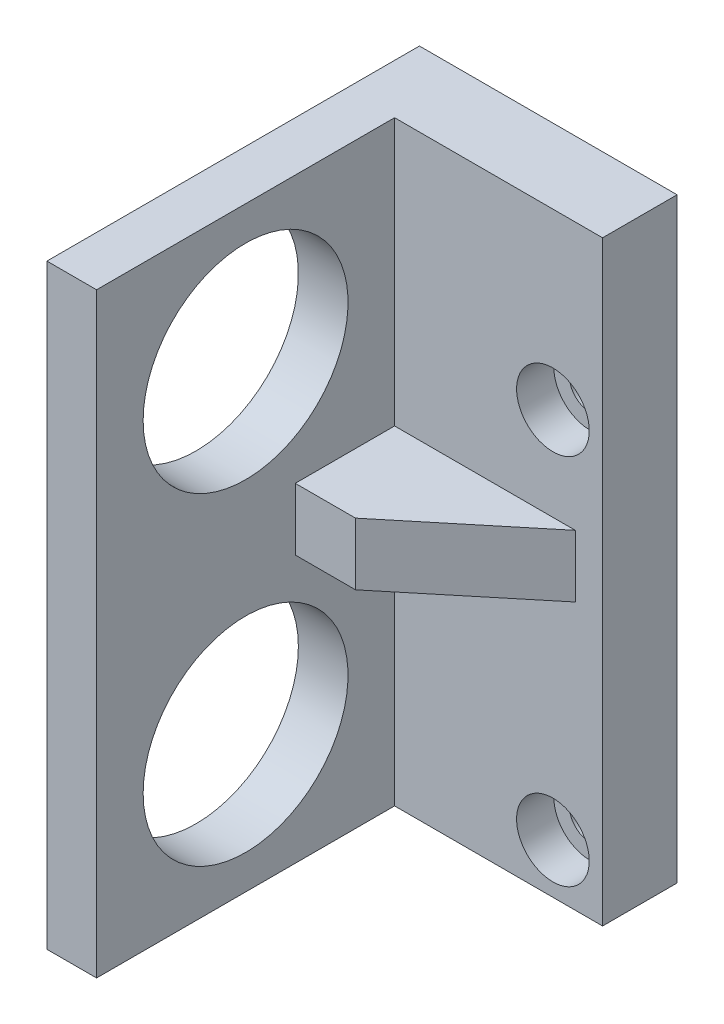
ISO-10303-21;
HEADER;
FILE_DESCRIPTION(('STEP AP214'),'2;1');
FILE_NAME('part.step','',(''),(''),'','','');
FILE_SCHEMA(('AUTOMOTIVE_DESIGN { 1 0 10303 214 1 1 1 1 }'));
ENDSEC;
DATA;
#1=APPLICATION_CONTEXT('core data for automotive mechanical design processes');
#2=APPLICATION_PROTOCOL_DEFINITION('international standard','automotive_design',2000,#1);
#3=PRODUCT_CONTEXT('',#1,'mechanical');
#4=PRODUCT('Part','Part','',(#3));
#5=PRODUCT_RELATED_PRODUCT_CATEGORY('part','',(#4));
#6=PRODUCT_DEFINITION_FORMATION('','',#4);
#7=PRODUCT_DEFINITION_CONTEXT('part definition',#1,'design');
#8=PRODUCT_DEFINITION('design','',#6,#7);
#9=PRODUCT_DEFINITION_SHAPE('','',#8);
#10=(LENGTH_UNIT() NAMED_UNIT(*) SI_UNIT(.MILLI.,.METRE.));
#11=(NAMED_UNIT(*) PLANE_ANGLE_UNIT() SI_UNIT($,.RADIAN.));
#12=(NAMED_UNIT(*) SI_UNIT($,.STERADIAN.) SOLID_ANGLE_UNIT());
#13=UNCERTAINTY_MEASURE_WITH_UNIT(LENGTH_MEASURE(1.E-05),#10,'distance_accuracy_value','');
#14=(GEOMETRIC_REPRESENTATION_CONTEXT(3) GLOBAL_UNCERTAINTY_ASSIGNED_CONTEXT((#13)) GLOBAL_UNIT_ASSIGNED_CONTEXT((#10,
#11,#12)) REPRESENTATION_CONTEXT('',''));
#15=CARTESIAN_POINT('',(0.,0.,0.));
#16=DIRECTION('',(0.,0.,1.));
#17=DIRECTION('',(1.,0.,0.));
#18=AXIS2_PLACEMENT_3D('',#15,#16,#17);
#19=CARTESIAN_POINT('',(18.5558838016959,26.5,6.));
#20=DIRECTION('',(-0.636111528755374,0.,-0.771597124790198));
#21=DIRECTION('',(-0.771597124790199,0.,0.636111528755374));
#22=AXIS2_PLACEMENT_3D('',#19,#20,#21);
#23=PLANE('',#22);
#24=DIRECTION('',(0.,1.,0.));
#25=VECTOR('',#24,1.);
#26=CARTESIAN_POINT('',(8.85196126723198,26.5,14.));
#27=LINE('',#26,#25);
#28=CARTESIAN_POINT('',(8.85196126723198,21.5,14.));
#29=VERTEX_POINT('',#28);
#30=CARTESIAN_POINT('',(8.85196126723198,26.5,14.));
#31=VERTEX_POINT('',#30);
#32=EDGE_CURVE('E218',#29,#31,#27,.T.);
#33=ORIENTED_EDGE('',*,*,#32,.F.);
#34=DIRECTION('',(0.771597124790198,0.,-0.636111528755374));
#35=VECTOR('',#34,1.);
#36=CARTESIAN_POINT('',(18.5558838016959,21.5,6.));
#37=LINE('',#36,#35);
#38=CARTESIAN_POINT('',(18.5558838016959,21.5,6.));
#39=VERTEX_POINT('',#38);
#40=EDGE_CURVE('E125',#29,#39,#37,.T.);
#41=ORIENTED_EDGE('',*,*,#40,.T.);
#42=DIRECTION('',(0.,-1.,0.));
#43=VECTOR('',#42,1.);
#44=CARTESIAN_POINT('',(18.5558838016959,26.5,6.));
#45=LINE('',#44,#43);
#46=CARTESIAN_POINT('',(18.5558838016959,26.5,6.));
#47=VERTEX_POINT('',#46);
#48=EDGE_CURVE('E136',#47,#39,#45,.T.);
#49=ORIENTED_EDGE('',*,*,#48,.F.);
#50=DIRECTION('',(0.771597124790198,0.,-0.636111528755374));
#51=VECTOR('',#50,1.);
#52=CARTESIAN_POINT('',(18.5558838016959,26.5,6.));
#53=LINE('',#52,#51);
#54=EDGE_CURVE('E128',#31,#47,#53,.T.);
#55=ORIENTED_EDGE('',*,*,#54,.F.);
#56=EDGE_LOOP('',(#33,#41,#49,#55));
#57=FACE_BOUND('',#56,.T.);
#58=ADVANCED_FACE('F33',(#57),#23,.F.);
#59=CARTESIAN_POINT('',(0.,26.5,0.));
#60=DIRECTION('',(0.,-1.,0.));
#61=DIRECTION('',(0.,0.,-1.));
#62=AXIS2_PLACEMENT_3D('',#59,#60,#61);
#63=PLANE('',#62);
#64=DIRECTION('',(-1.,0.,0.));
#65=VECTOR('',#64,1.);
#66=CARTESIAN_POINT('',(38.,26.5,14.));
#67=LINE('',#66,#65);
#68=CARTESIAN_POINT('',(4.,26.5,14.));
#69=VERTEX_POINT('',#68);
#70=EDGE_CURVE('E116',#31,#69,#67,.T.);
#71=ORIENTED_EDGE('',*,*,#70,.F.);
#72=ORIENTED_EDGE('',*,*,#54,.T.);
#73=DIRECTION('',(-1.,0.,0.));
#74=VECTOR('',#73,1.);
#75=CARTESIAN_POINT('',(4.,26.5,6.));
#76=LINE('',#75,#74);
#77=CARTESIAN_POINT('',(4.,26.5,6.));
#78=VERTEX_POINT('',#77);
#79=EDGE_CURVE('E131',#47,#78,#76,.T.);
#80=ORIENTED_EDGE('',*,*,#79,.T.);
#81=DIRECTION('',(0.,0.,1.));
#82=VECTOR('',#81,1.);
#83=CARTESIAN_POINT('',(4.,26.5,18.));
#84=LINE('',#83,#82);
#85=EDGE_CURVE('E140',#78,#69,#84,.T.);
#86=ORIENTED_EDGE('',*,*,#85,.T.);
#87=EDGE_LOOP('',(#71,#72,#80,#86));
#88=FACE_BOUND('',#87,.T.);
#89=ADVANCED_FACE('F229',(#88),#63,.F.);
#90=CARTESIAN_POINT('',(0.,21.5,0.));
#91=DIRECTION('',(0.,-1.,0.));
#92=DIRECTION('',(0.,0.,-1.));
#93=AXIS2_PLACEMENT_3D('',#90,#91,#92);
#94=PLANE('',#93);
#95=ORIENTED_EDGE('',*,*,#40,.F.);
#96=DIRECTION('',(-1.,0.,0.));
#97=VECTOR('',#96,1.);
#98=CARTESIAN_POINT('',(0.,21.5,14.));
#99=LINE('',#98,#97);
#100=CARTESIAN_POINT('',(4.,21.5,14.));
#101=VERTEX_POINT('',#100);
#102=EDGE_CURVE('E11',#29,#101,#99,.T.);
#103=ORIENTED_EDGE('',*,*,#102,.T.);
#104=DIRECTION('',(0.,0.,1.));
#105=VECTOR('',#104,1.);
#106=CARTESIAN_POINT('',(4.,21.5,18.));
#107=LINE('',#106,#105);
#108=CARTESIAN_POINT('',(4.,21.5,6.));
#109=VERTEX_POINT('',#108);
#110=EDGE_CURVE('E124',#109,#101,#107,.T.);
#111=ORIENTED_EDGE('',*,*,#110,.F.);
#112=DIRECTION('',(-1.,0.,0.));
#113=VECTOR('',#112,1.);
#114=CARTESIAN_POINT('',(4.,21.5,6.));
#115=LINE('',#114,#113);
#116=EDGE_CURVE('E129',#39,#109,#115,.T.);
#117=ORIENTED_EDGE('',*,*,#116,.F.);
#118=EDGE_LOOP('',(#95,#103,#111,#117));
#119=FACE_BOUND('',#118,.T.);
#120=ADVANCED_FACE('F122',(#119),#94,.T.);
#121=CARTESIAN_POINT('',(16.75,34.,6.));
#122=DIRECTION('',(0.,0.,-1.));
#123=DIRECTION('',(-1.,0.,0.));
#124=AXIS2_PLACEMENT_3D('',#121,#122,#123);
#125=CYLINDRICAL_SURFACE('',#124,1.67500000000001);
#126=CARTESIAN_POINT('',(16.75,34.,0.));
#127=DIRECTION('',(0.,0.,1.));
#128=DIRECTION('',(1.,0.,0.));
#129=AXIS2_PLACEMENT_3D('',#126,#127,#128);
#130=CIRCLE('',#129,1.67500000000001);
#131=CARTESIAN_POINT('',(18.425,34.,0.));
#132=VERTEX_POINT('',#131);
#133=EDGE_CURVE('E169',#132,#132,#130,.T.);
#134=ORIENTED_EDGE('',*,*,#133,.F.);
#135=EDGE_LOOP('',(#134));
#136=FACE_BOUND('',#135,.T.);
#137=CARTESIAN_POINT('',(16.75,34.,3.));
#138=DIRECTION('',(0.,0.,1.));
#139=DIRECTION('',(1.,0.,0.));
#140=AXIS2_PLACEMENT_3D('',#137,#138,#139);
#141=CIRCLE('',#140,1.67500000000001);
#142=CARTESIAN_POINT('',(18.425,34.,3.));
#143=VERTEX_POINT('',#142);
#144=EDGE_CURVE('E204',#143,#143,#141,.T.);
#145=ORIENTED_EDGE('',*,*,#144,.T.);
#146=EDGE_LOOP('',(#145));
#147=FACE_BOUND('',#146,.T.);
#148=ADVANCED_FACE('F288',(#136,#147),#125,.F.);
#149=CARTESIAN_POINT('',(16.75,4.,6.));
#150=DIRECTION('',(0.,0.,-1.));
#151=DIRECTION('',(-1.,0.,0.));
#152=AXIS2_PLACEMENT_3D('',#149,#150,#151);
#153=CYLINDRICAL_SURFACE('',#152,1.675);
#154=CARTESIAN_POINT('',(16.75,4.,0.));
#155=DIRECTION('',(0.,0.,1.));
#156=DIRECTION('',(1.,0.,0.));
#157=AXIS2_PLACEMENT_3D('',#154,#155,#156);
#158=CIRCLE('',#157,1.675);
#159=CARTESIAN_POINT('',(18.425,4.,0.));
#160=VERTEX_POINT('',#159);
#161=EDGE_CURVE('E166',#160,#160,#158,.T.);
#162=ORIENTED_EDGE('',*,*,#161,.F.);
#163=EDGE_LOOP('',(#162));
#164=FACE_BOUND('',#163,.T.);
#165=CARTESIAN_POINT('',(16.75,4.,3.));
#166=DIRECTION('',(0.,0.,1.));
#167=DIRECTION('',(1.,0.,0.));
#168=AXIS2_PLACEMENT_3D('',#165,#166,#167);
#169=CIRCLE('',#168,1.675);
#170=CARTESIAN_POINT('',(18.425,4.,3.));
#171=VERTEX_POINT('',#170);
#172=EDGE_CURVE('E202',#171,#171,#169,.T.);
#173=ORIENTED_EDGE('',*,*,#172,.T.);
#174=EDGE_LOOP('',(#173));
#175=FACE_BOUND('',#174,.T.);
#176=ADVANCED_FACE('F285',(#164,#175),#153,.F.);
#177=CARTESIAN_POINT('',(0.,0.,6.));
#178=DIRECTION('',(0.,0.,-1.));
#179=DIRECTION('',(-1.,0.,0.));
#180=AXIS2_PLACEMENT_3D('',#177,#178,#179);
#181=PLANE('',#180);
#182=CARTESIAN_POINT('',(16.75,34.,6.));
#183=DIRECTION('',(0.,0.,1.));
#184=DIRECTION('',(1.,0.,0.));
#185=AXIS2_PLACEMENT_3D('',#182,#183,#184);
#186=CIRCLE('',#185,2.925);
#187=CARTESIAN_POINT('',(19.675,34.,6.));
#188=VERTEX_POINT('',#187);
#189=EDGE_CURVE('E221',#188,#188,#186,.T.);
#190=ORIENTED_EDGE('',*,*,#189,.F.);
#191=EDGE_LOOP('',(#190));
#192=FACE_BOUND('',#191,.T.);
#193=CARTESIAN_POINT('',(16.75,4.,6.));
#194=DIRECTION('',(0.,0.,1.));
#195=DIRECTION('',(1.,0.,0.));
#196=AXIS2_PLACEMENT_3D('',#193,#194,#195);
#197=CIRCLE('',#196,2.925);
#198=CARTESIAN_POINT('',(19.675,4.,6.));
#199=VERTEX_POINT('',#198);
#200=EDGE_CURVE('E214',#199,#199,#197,.T.);
#201=ORIENTED_EDGE('',*,*,#200,.F.);
#202=EDGE_LOOP('',(#201));
#203=FACE_BOUND('',#202,.T.);
#204=ORIENTED_EDGE('',*,*,#79,.F.);
#205=ORIENTED_EDGE('',*,*,#48,.T.);
#206=ORIENTED_EDGE('',*,*,#116,.T.);
#207=DIRECTION('',(0.,1.,0.));
#208=VECTOR('',#207,1.);
#209=CARTESIAN_POINT('',(4.,0.,6.));
#210=LINE('',#209,#208);
#211=CARTESIAN_POINT('',(4.,0.,6.));
#212=VERTEX_POINT('',#211);
#213=EDGE_CURVE('E48',#212,#109,#210,.T.);
#214=ORIENTED_EDGE('',*,*,#213,.F.);
#215=DIRECTION('',(1.,0.,0.));
#216=VECTOR('',#215,1.);
#217=CARTESIAN_POINT('',(0.,0.,6.));
#218=LINE('',#217,#216);
#219=CARTESIAN_POINT('',(20.75,0.,6.));
#220=VERTEX_POINT('',#219);
#221=EDGE_CURVE('E173',#212,#220,#218,.T.);
#222=ORIENTED_EDGE('',*,*,#221,.T.);
#223=DIRECTION('',(0.,1.,0.));
#224=VECTOR('',#223,1.);
#225=CARTESIAN_POINT('',(20.75,0.,6.));
#226=LINE('',#225,#224);
#227=CARTESIAN_POINT('',(20.75,48.,6.));
#228=VERTEX_POINT('',#227);
#229=EDGE_CURVE('E175',#220,#228,#226,.T.);
#230=ORIENTED_EDGE('',*,*,#229,.T.);
#231=DIRECTION('',(-1.,0.,0.));
#232=VECTOR('',#231,1.);
#233=CARTESIAN_POINT('',(0.,48.,6.));
#234=LINE('',#233,#232);
#235=CARTESIAN_POINT('',(4.,48.,6.));
#236=VERTEX_POINT('',#235);
#237=EDGE_CURVE('E178',#228,#236,#234,.T.);
#238=ORIENTED_EDGE('',*,*,#237,.T.);
#239=EDGE_CURVE('E56',#78,#236,#210,.T.);
#240=ORIENTED_EDGE('',*,*,#239,.F.);
#241=EDGE_LOOP('',(#204,#205,#206,#214,#222,#230,#238,#240));
#242=FACE_BOUND('',#241,.T.);
#243=ADVANCED_FACE('F231',(#192,#203,#242),#181,.F.);
#244=CARTESIAN_POINT('',(4.,0.,0.));
#245=DIRECTION('',(-1.,0.,0.));
#246=DIRECTION('',(0.,0.,1.));
#247=AXIS2_PLACEMENT_3D('',#244,#245,#246);
#248=PLANE('',#247);
#249=CARTESIAN_POINT('',(4.,11.,18.));
#250=DIRECTION('',(-1.,0.,0.));
#251=DIRECTION('',(0.,0.,1.));
#252=AXIS2_PLACEMENT_3D('',#249,#250,#251);
#253=CIRCLE('',#252,8.25);
#254=CARTESIAN_POINT('',(4.,11.,26.25));
#255=VERTEX_POINT('',#254);
#256=EDGE_CURVE('E144',#255,#255,#253,.T.);
#257=ORIENTED_EDGE('',*,*,#256,.T.);
#258=EDGE_LOOP('',(#257));
#259=FACE_BOUND('',#258,.T.);
#260=CARTESIAN_POINT('',(4.,37.,18.));
#261=DIRECTION('',(-1.,0.,0.));
#262=DIRECTION('',(0.,0.,1.));
#263=AXIS2_PLACEMENT_3D('',#260,#261,#262);
#264=CIRCLE('',#263,8.25);
#265=CARTESIAN_POINT('',(4.,37.,26.25));
#266=VERTEX_POINT('',#265);
#267=EDGE_CURVE('E159',#266,#266,#264,.T.);
#268=ORIENTED_EDGE('',*,*,#267,.T.);
#269=EDGE_LOOP('',(#268));
#270=FACE_BOUND('',#269,.T.);
#271=ORIENTED_EDGE('',*,*,#85,.F.);
#272=ORIENTED_EDGE('',*,*,#239,.T.);
#273=DIRECTION('',(0.,0.,-1.));
#274=VECTOR('',#273,1.);
#275=CARTESIAN_POINT('',(4.,48.,0.));
#276=LINE('',#275,#274);
#277=CARTESIAN_POINT('',(4.,48.,30.));
#278=VERTEX_POINT('',#277);
#279=EDGE_CURVE('E153',#278,#236,#276,.T.);
#280=ORIENTED_EDGE('',*,*,#279,.F.);
#281=DIRECTION('',(0.,1.,0.));
#282=VECTOR('',#281,1.);
#283=CARTESIAN_POINT('',(4.,48.,30.));
#284=LINE('',#283,#282);
#285=CARTESIAN_POINT('',(4.,0.,30.));
#286=VERTEX_POINT('',#285);
#287=EDGE_CURVE('E149',#286,#278,#284,.T.);
#288=ORIENTED_EDGE('',*,*,#287,.F.);
#289=DIRECTION('',(0.,0.,1.));
#290=VECTOR('',#289,1.);
#291=CARTESIAN_POINT('',(4.,0.,0.));
#292=LINE('',#291,#290);
#293=EDGE_CURVE('E147',#212,#286,#292,.T.);
#294=ORIENTED_EDGE('',*,*,#293,.F.);
#295=ORIENTED_EDGE('',*,*,#213,.T.);
#296=ORIENTED_EDGE('',*,*,#110,.T.);
#297=DIRECTION('',(0.,1.,0.));
#298=VECTOR('',#297,1.);
#299=CARTESIAN_POINT('',(4.,21.5,14.));
#300=LINE('',#299,#298);
#301=EDGE_CURVE('E112',#101,#69,#300,.T.);
#302=ORIENTED_EDGE('',*,*,#301,.T.);
#303=EDGE_LOOP('',(#271,#272,#280,#288,#294,#295,#296,#302));
#304=FACE_BOUND('',#303,.T.);
#305=ADVANCED_FACE('F126',(#259,#270,#304),#248,.F.);
#306=CARTESIAN_POINT('',(0.,0.,0.));
#307=DIRECTION('',(0.,0.,-1.));
#308=DIRECTION('',(-1.,0.,0.));
#309=AXIS2_PLACEMENT_3D('',#306,#307,#308);
#310=PLANE('',#309);
#311=DIRECTION('',(0.,-1.,0.));
#312=VECTOR('',#311,1.);
#313=CARTESIAN_POINT('',(0.,0.,0.));
#314=LINE('',#313,#312);
#315=CARTESIAN_POINT('',(0.,48.,0.));
#316=VERTEX_POINT('',#315);
#317=CARTESIAN_POINT('',(0.,0.,0.));
#318=VERTEX_POINT('',#317);
#319=EDGE_CURVE('E172',#316,#318,#314,.T.);
#320=ORIENTED_EDGE('',*,*,#319,.F.);
#321=DIRECTION('',(-1.,0.,0.));
#322=VECTOR('',#321,1.);
#323=CARTESIAN_POINT('',(0.,48.,0.));
#324=LINE('',#323,#322);
#325=CARTESIAN_POINT('',(20.75,48.,0.));
#326=VERTEX_POINT('',#325);
#327=EDGE_CURVE('E176',#326,#316,#324,.T.);
#328=ORIENTED_EDGE('',*,*,#327,.F.);
#329=DIRECTION('',(0.,1.,0.));
#330=VECTOR('',#329,1.);
#331=CARTESIAN_POINT('',(20.75,0.,0.));
#332=LINE('',#331,#330);
#333=CARTESIAN_POINT('',(20.75,0.,0.));
#334=VERTEX_POINT('',#333);
#335=EDGE_CURVE('E185',#334,#326,#332,.T.);
#336=ORIENTED_EDGE('',*,*,#335,.F.);
#337=DIRECTION('',(1.,0.,0.));
#338=VECTOR('',#337,1.);
#339=CARTESIAN_POINT('',(0.,0.,0.));
#340=LINE('',#339,#338);
#341=EDGE_CURVE('E183',#318,#334,#340,.T.);
#342=ORIENTED_EDGE('',*,*,#341,.F.);
#343=EDGE_LOOP('',(#320,#328,#336,#342));
#344=FACE_BOUND('',#343,.T.);
#345=ORIENTED_EDGE('',*,*,#133,.T.);
#346=EDGE_LOOP('',(#345));
#347=FACE_BOUND('',#346,.T.);
#348=ORIENTED_EDGE('',*,*,#161,.T.);
#349=EDGE_LOOP('',(#348));
#350=FACE_BOUND('',#349,.T.);
#351=ADVANCED_FACE('F251',(#344,#347,#350),#310,.T.);
#352=CARTESIAN_POINT('',(0.,0.,6.));
#353=DIRECTION('',(1.,0.,0.));
#354=DIRECTION('',(0.,0.,-1.));
#355=AXIS2_PLACEMENT_3D('',#352,#353,#354);
#356=PLANE('',#355);
#357=CARTESIAN_POINT('',(0.,37.,18.));
#358=DIRECTION('',(-1.,0.,0.));
#359=DIRECTION('',(0.,0.,1.));
#360=AXIS2_PLACEMENT_3D('',#357,#358,#359);
#361=CIRCLE('',#360,8.25);
#362=CARTESIAN_POINT('',(0.,37.,26.25));
#363=VERTEX_POINT('',#362);
#364=EDGE_CURVE('E141',#363,#363,#361,.T.);
#365=ORIENTED_EDGE('',*,*,#364,.F.);
#366=EDGE_LOOP('',(#365));
#367=FACE_BOUND('',#366,.T.);
#368=CARTESIAN_POINT('',(0.,11.,18.));
#369=DIRECTION('',(-1.,0.,0.));
#370=DIRECTION('',(0.,0.,-1.));
#371=AXIS2_PLACEMENT_3D('',#368,#369,#370);
#372=CIRCLE('',#371,8.25);
#373=CARTESIAN_POINT('',(0.,11.,9.75000000000001));
#374=VERTEX_POINT('',#373);
#375=EDGE_CURVE('E139',#374,#374,#372,.T.);
#376=ORIENTED_EDGE('',*,*,#375,.F.);
#377=EDGE_LOOP('',(#376));
#378=FACE_BOUND('',#377,.T.);
#379=ORIENTED_EDGE('',*,*,#319,.T.);
#380=DIRECTION('',(0.,0.,-1.));
#381=VECTOR('',#380,1.);
#382=CARTESIAN_POINT('',(0.,0.,6.));
#383=LINE('',#382,#381);
#384=CARTESIAN_POINT('',(0.,0.,30.));
#385=VERTEX_POINT('',#384);
#386=EDGE_CURVE('E41',#385,#318,#383,.T.);
#387=ORIENTED_EDGE('',*,*,#386,.F.);
#388=DIRECTION('',(0.,1.,0.));
#389=VECTOR('',#388,1.);
#390=CARTESIAN_POINT('',(0.,48.,30.));
#391=LINE('',#390,#389);
#392=CARTESIAN_POINT('',(0.,48.,30.));
#393=VERTEX_POINT('',#392);
#394=EDGE_CURVE('E150',#385,#393,#391,.T.);
#395=ORIENTED_EDGE('',*,*,#394,.T.);
#396=DIRECTION('',(0.,0.,-1.));
#397=VECTOR('',#396,1.);
#398=CARTESIAN_POINT('',(0.,48.,6.));
#399=LINE('',#398,#397);
#400=EDGE_CURVE('E180',#393,#316,#399,.T.);
#401=ORIENTED_EDGE('',*,*,#400,.T.);
#402=EDGE_LOOP('',(#379,#387,#395,#401));
#403=FACE_BOUND('',#402,.T.);
#404=ADVANCED_FACE('F35',(#367,#378,#403),#356,.F.);
#405=CARTESIAN_POINT('',(0.,0.,6.));
#406=DIRECTION('',(0.,1.,0.));
#407=DIRECTION('',(0.,0.,1.));
#408=AXIS2_PLACEMENT_3D('',#405,#406,#407);
#409=PLANE('',#408);
#410=ORIENTED_EDGE('',*,*,#341,.T.);
#411=DIRECTION('',(0.,0.,-1.));
#412=VECTOR('',#411,1.);
#413=CARTESIAN_POINT('',(20.75,0.,6.));
#414=LINE('',#413,#412);
#415=EDGE_CURVE('E193',#220,#334,#414,.T.);
#416=ORIENTED_EDGE('',*,*,#415,.F.);
#417=ORIENTED_EDGE('',*,*,#221,.F.);
#418=ORIENTED_EDGE('',*,*,#293,.T.);
#419=DIRECTION('',(-1.,0.,0.));
#420=VECTOR('',#419,1.);
#421=CARTESIAN_POINT('',(4.,0.,30.));
#422=LINE('',#421,#420);
#423=EDGE_CURVE('E156',#286,#385,#422,.T.);
#424=ORIENTED_EDGE('',*,*,#423,.T.);
#425=ORIENTED_EDGE('',*,*,#386,.T.);
#426=EDGE_LOOP('',(#410,#416,#417,#418,#424,#425));
#427=FACE_BOUND('',#426,.T.);
#428=ADVANCED_FACE('F243',(#427),#409,.F.);
#429=CARTESIAN_POINT('',(20.75,0.,6.));
#430=DIRECTION('',(-1.,0.,0.));
#431=DIRECTION('',(0.,0.,1.));
#432=AXIS2_PLACEMENT_3D('',#429,#430,#431);
#433=PLANE('',#432);
#434=ORIENTED_EDGE('',*,*,#335,.T.);
#435=DIRECTION('',(0.,0.,-1.));
#436=VECTOR('',#435,1.);
#437=CARTESIAN_POINT('',(20.75,48.,6.));
#438=LINE('',#437,#436);
#439=EDGE_CURVE('E190',#228,#326,#438,.T.);
#440=ORIENTED_EDGE('',*,*,#439,.F.);
#441=ORIENTED_EDGE('',*,*,#229,.F.);
#442=ORIENTED_EDGE('',*,*,#415,.T.);
#443=EDGE_LOOP('',(#434,#440,#441,#442));
#444=FACE_BOUND('',#443,.T.);
#445=ADVANCED_FACE('F247',(#444),#433,.F.);
#446=CARTESIAN_POINT('',(0.,48.,6.));
#447=DIRECTION('',(0.,-1.,0.));
#448=DIRECTION('',(0.,0.,-1.));
#449=AXIS2_PLACEMENT_3D('',#446,#447,#448);
#450=PLANE('',#449);
#451=ORIENTED_EDGE('',*,*,#400,.F.);
#452=DIRECTION('',(-1.,0.,0.));
#453=VECTOR('',#452,1.);
#454=CARTESIAN_POINT('',(4.,48.,30.));
#455=LINE('',#454,#453);
#456=EDGE_CURVE('E160',#278,#393,#455,.T.);
#457=ORIENTED_EDGE('',*,*,#456,.F.);
#458=ORIENTED_EDGE('',*,*,#279,.T.);
#459=ORIENTED_EDGE('',*,*,#237,.F.);
#460=ORIENTED_EDGE('',*,*,#439,.T.);
#461=ORIENTED_EDGE('',*,*,#327,.T.);
#462=EDGE_LOOP('',(#451,#457,#458,#459,#460,#461));
#463=FACE_BOUND('',#462,.T.);
#464=ADVANCED_FACE('F236',(#463),#450,.F.);
#465=CARTESIAN_POINT('',(4.,48.,30.));
#466=DIRECTION('',(0.,0.,1.));
#467=DIRECTION('',(1.,0.,0.));
#468=AXIS2_PLACEMENT_3D('',#465,#466,#467);
#469=PLANE('',#468);
#470=ORIENTED_EDGE('',*,*,#394,.F.);
#471=ORIENTED_EDGE('',*,*,#423,.F.);
#472=ORIENTED_EDGE('',*,*,#287,.T.);
#473=ORIENTED_EDGE('',*,*,#456,.T.);
#474=EDGE_LOOP('',(#470,#471,#472,#473));
#475=FACE_BOUND('',#474,.T.);
#476=ADVANCED_FACE('F241',(#475),#469,.T.);
#477=CARTESIAN_POINT('',(6.,11.,18.));
#478=DIRECTION('',(-1.,0.,0.));
#479=DIRECTION('',(0.,0.,1.));
#480=AXIS2_PLACEMENT_3D('',#477,#478,#479);
#481=CYLINDRICAL_SURFACE('',#480,8.25);
#482=ORIENTED_EDGE('',*,*,#375,.T.);
#483=EDGE_LOOP('',(#482));
#484=FACE_BOUND('',#483,.T.);
#485=ORIENTED_EDGE('',*,*,#256,.F.);
#486=EDGE_LOOP('',(#485));
#487=FACE_BOUND('',#486,.T.);
#488=ADVANCED_FACE('F275',(#484,#487),#481,.F.);
#489=CARTESIAN_POINT('',(6.,37.,18.));
#490=DIRECTION('',(-1.,0.,0.));
#491=DIRECTION('',(0.,0.,1.));
#492=AXIS2_PLACEMENT_3D('',#489,#490,#491);
#493=CYLINDRICAL_SURFACE('',#492,8.25);
#494=ORIENTED_EDGE('',*,*,#364,.T.);
#495=EDGE_LOOP('',(#494));
#496=FACE_BOUND('',#495,.T.);
#497=ORIENTED_EDGE('',*,*,#267,.F.);
#498=EDGE_LOOP('',(#497));
#499=FACE_BOUND('',#498,.T.);
#500=ADVANCED_FACE('F271',(#496,#499),#493,.F.);
#501=CARTESIAN_POINT('',(16.75,4.,3.));
#502=DIRECTION('',(0.,0.,1.));
#503=DIRECTION('',(1.,0.,0.));
#504=AXIS2_PLACEMENT_3D('',#501,#502,#503);
#505=CYLINDRICAL_SURFACE('',#504,2.925);
#506=CARTESIAN_POINT('',(16.75,4.,3.));
#507=DIRECTION('',(0.,0.,1.));
#508=DIRECTION('',(1.,0.,0.));
#509=AXIS2_PLACEMENT_3D('',#506,#507,#508);
#510=CIRCLE('',#509,2.925);
#511=CARTESIAN_POINT('',(19.675,4.,3.));
#512=VERTEX_POINT('',#511);
#513=EDGE_CURVE('E217',#512,#512,#510,.T.);
#514=ORIENTED_EDGE('',*,*,#513,.F.);
#515=EDGE_LOOP('',(#514));
#516=FACE_BOUND('',#515,.T.);
#517=ORIENTED_EDGE('',*,*,#200,.T.);
#518=EDGE_LOOP('',(#517));
#519=FACE_BOUND('',#518,.T.);
#520=ADVANCED_FACE('F274',(#516,#519),#505,.F.);
#521=CARTESIAN_POINT('',(16.75,4.,3.));
#522=DIRECTION('',(0.,0.,1.));
#523=DIRECTION('',(1.,0.,0.));
#524=AXIS2_PLACEMENT_3D('',#521,#522,#523);
#525=PLANE('',#524);
#526=ORIENTED_EDGE('',*,*,#172,.F.);
#527=EDGE_LOOP('',(#526));
#528=FACE_BOUND('',#527,.T.);
#529=ORIENTED_EDGE('',*,*,#513,.T.);
#530=EDGE_LOOP('',(#529));
#531=FACE_BOUND('',#530,.T.);
#532=ADVANCED_FACE('F327',(#528,#531),#525,.T.);
#533=CARTESIAN_POINT('',(16.75,34.,3.));
#534=DIRECTION('',(0.,0.,1.));
#535=DIRECTION('',(1.,0.,0.));
#536=AXIS2_PLACEMENT_3D('',#533,#534,#535);
#537=CYLINDRICAL_SURFACE('',#536,2.925);
#538=CARTESIAN_POINT('',(16.75,34.,3.));
#539=DIRECTION('',(0.,0.,1.));
#540=DIRECTION('',(1.,0.,0.));
#541=AXIS2_PLACEMENT_3D('',#538,#539,#540);
#542=CIRCLE('',#541,2.925);
#543=CARTESIAN_POINT('',(19.675,34.,3.));
#544=VERTEX_POINT('',#543);
#545=EDGE_CURVE('E205',#544,#544,#542,.T.);
#546=ORIENTED_EDGE('',*,*,#545,.F.);
#547=EDGE_LOOP('',(#546));
#548=FACE_BOUND('',#547,.T.);
#549=ORIENTED_EDGE('',*,*,#189,.T.);
#550=EDGE_LOOP('',(#549));
#551=FACE_BOUND('',#550,.T.);
#552=ADVANCED_FACE('F336',(#548,#551),#537,.F.);
#553=CARTESIAN_POINT('',(16.75,34.,3.));
#554=DIRECTION('',(0.,0.,1.));
#555=DIRECTION('',(1.,0.,0.));
#556=AXIS2_PLACEMENT_3D('',#553,#554,#555);
#557=PLANE('',#556);
#558=ORIENTED_EDGE('',*,*,#144,.F.);
#559=EDGE_LOOP('',(#558));
#560=FACE_BOUND('',#559,.T.);
#561=ORIENTED_EDGE('',*,*,#545,.T.);
#562=EDGE_LOOP('',(#561));
#563=FACE_BOUND('',#562,.T.);
#564=ADVANCED_FACE('F344',(#560,#563),#557,.T.);
#565=CARTESIAN_POINT('',(38.,21.5,14.));
#566=DIRECTION('',(0.,0.,1.));
#567=DIRECTION('',(1.,0.,0.));
#568=AXIS2_PLACEMENT_3D('',#565,#566,#567);
#569=PLANE('',#568);
#570=ORIENTED_EDGE('',*,*,#32,.T.);
#571=ORIENTED_EDGE('',*,*,#70,.T.);
#572=ORIENTED_EDGE('',*,*,#301,.F.);
#573=ORIENTED_EDGE('',*,*,#102,.F.);
#574=EDGE_LOOP('',(#570,#571,#572,#573));
#575=FACE_BOUND('',#574,.T.);
#576=ADVANCED_FACE('F113',(#575),#569,.T.);
#577=CLOSED_SHELL('',(#58,#89,#120,#148,#176,#243,#305,#351,#404,#428,#445,#464,#476,#488,#500,
#520,#532,#552,#564,#576));
#578=MANIFOLD_SOLID_BREP('B2',#577);
#579=ADVANCED_BREP_SHAPE_REPRESENTATION('',(#18,#578),#14);
#580=SHAPE_DEFINITION_REPRESENTATION(#9,#579);
ENDSEC;
END-ISO-10303-21;
